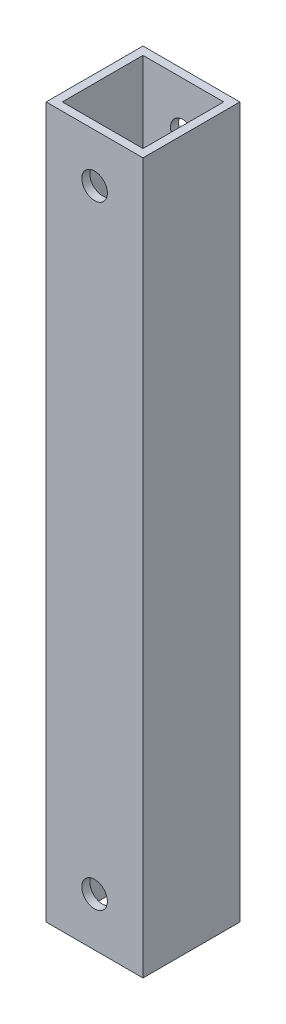
ISO-10303-21;
HEADER;
FILE_DESCRIPTION(('STEP AP214'),'2;1');
FILE_NAME('part.step','',(''),(''),'','','');
FILE_SCHEMA(('AUTOMOTIVE_DESIGN { 1 0 10303 214 1 1 1 1 }'));
ENDSEC;
DATA;
#1=APPLICATION_CONTEXT('core data for automotive mechanical design processes');
#2=APPLICATION_PROTOCOL_DEFINITION('international standard','automotive_design',2000,#1);
#3=PRODUCT_CONTEXT('',#1,'mechanical');
#4=PRODUCT('Part','Part','',(#3));
#5=PRODUCT_RELATED_PRODUCT_CATEGORY('part','',(#4));
#6=PRODUCT_DEFINITION_FORMATION('','',#4);
#7=PRODUCT_DEFINITION_CONTEXT('part definition',#1,'design');
#8=PRODUCT_DEFINITION('design','',#6,#7);
#9=PRODUCT_DEFINITION_SHAPE('','',#8);
#10=(LENGTH_UNIT() NAMED_UNIT(*) SI_UNIT(.MILLI.,.METRE.));
#11=(NAMED_UNIT(*) PLANE_ANGLE_UNIT() SI_UNIT($,.RADIAN.));
#12=(NAMED_UNIT(*) SI_UNIT($,.STERADIAN.) SOLID_ANGLE_UNIT());
#13=UNCERTAINTY_MEASURE_WITH_UNIT(LENGTH_MEASURE(1.E-05),#10,'distance_accuracy_value','');
#14=(GEOMETRIC_REPRESENTATION_CONTEXT(3) GLOBAL_UNCERTAINTY_ASSIGNED_CONTEXT((#13)) GLOBAL_UNIT_ASSIGNED_CONTEXT((#10,
#11,#12)) REPRESENTATION_CONTEXT('',''));
#15=CARTESIAN_POINT('',(0.,0.,0.));
#16=DIRECTION('',(0.,0.,1.));
#17=DIRECTION('',(1.,0.,0.));
#18=AXIS2_PLACEMENT_3D('',#15,#16,#17);
#19=CARTESIAN_POINT('',(0.,279.4,0.));
#20=DIRECTION('',(0.,-1.,0.));
#21=DIRECTION('',(0.,0.,-1.));
#22=AXIS2_PLACEMENT_3D('',#19,#20,#21);
#23=PLANE('',#22);
#24=DIRECTION('',(0.,0.,1.));
#25=VECTOR('',#24,1.);
#26=CARTESIAN_POINT('',(0.,279.4,0.));
#27=LINE('',#26,#25);
#28=CARTESIAN_POINT('',(0.,279.4,-38.1));
#29=VERTEX_POINT('',#28);
#30=CARTESIAN_POINT('',(0.,279.4,0.));
#31=VERTEX_POINT('',#30);
#32=EDGE_CURVE('E137',#29,#31,#27,.T.);
#33=ORIENTED_EDGE('',*,*,#32,.T.);
#34=DIRECTION('',(1.,0.,0.));
#35=VECTOR('',#34,1.);
#36=CARTESIAN_POINT('',(0.,279.4,0.));
#37=LINE('',#36,#35);
#38=CARTESIAN_POINT('',(38.1,279.4,0.));
#39=VERTEX_POINT('',#38);
#40=EDGE_CURVE('E140',#31,#39,#37,.T.);
#41=ORIENTED_EDGE('',*,*,#40,.T.);
#42=DIRECTION('',(0.,0.,-1.));
#43=VECTOR('',#42,1.);
#44=CARTESIAN_POINT('',(38.1,279.4,0.));
#45=LINE('',#44,#43);
#46=CARTESIAN_POINT('',(38.1,279.4,-38.1));
#47=VERTEX_POINT('',#46);
#48=EDGE_CURVE('E143',#39,#47,#45,.T.);
#49=ORIENTED_EDGE('',*,*,#48,.T.);
#50=DIRECTION('',(-1.,0.,0.));
#51=VECTOR('',#50,1.);
#52=CARTESIAN_POINT('',(0.,279.4,-38.1));
#53=LINE('',#52,#51);
#54=EDGE_CURVE('E145',#47,#29,#53,.T.);
#55=ORIENTED_EDGE('',*,*,#54,.T.);
#56=EDGE_LOOP('',(#33,#41,#49,#55));
#57=FACE_BOUND('',#56,.T.);
#58=DIRECTION('',(0.,0.,1.));
#59=VECTOR('',#58,1.);
#60=CARTESIAN_POINT('',(3.175,279.4,-3.175));
#61=LINE('',#60,#59);
#62=CARTESIAN_POINT('',(3.175,279.4,-34.925));
#63=VERTEX_POINT('',#62);
#64=CARTESIAN_POINT('',(3.175,279.4,-3.175));
#65=VERTEX_POINT('',#64);
#66=EDGE_CURVE('E99',#63,#65,#61,.T.);
#67=ORIENTED_EDGE('',*,*,#66,.F.);
#68=DIRECTION('',(-1.,0.,0.));
#69=VECTOR('',#68,1.);
#70=CARTESIAN_POINT('',(3.175,279.4,-34.925));
#71=LINE('',#70,#69);
#72=CARTESIAN_POINT('',(34.925,279.4,-34.925));
#73=VERTEX_POINT('',#72);
#74=EDGE_CURVE('E121',#73,#63,#71,.T.);
#75=ORIENTED_EDGE('',*,*,#74,.F.);
#76=DIRECTION('',(0.,0.,-1.));
#77=VECTOR('',#76,1.);
#78=CARTESIAN_POINT('',(34.925,279.4,-3.175));
#79=LINE('',#78,#77);
#80=CARTESIAN_POINT('',(34.925,279.4,-3.175));
#81=VERTEX_POINT('',#80);
#82=EDGE_CURVE('E119',#81,#73,#79,.T.);
#83=ORIENTED_EDGE('',*,*,#82,.F.);
#84=DIRECTION('',(1.,0.,0.));
#85=VECTOR('',#84,1.);
#86=CARTESIAN_POINT('',(3.175,279.4,-3.175));
#87=LINE('',#86,#85);
#88=EDGE_CURVE('E107',#65,#81,#87,.T.);
#89=ORIENTED_EDGE('',*,*,#88,.F.);
#90=EDGE_LOOP('',(#67,#75,#83,#89));
#91=FACE_BOUND('',#90,.T.);
#92=ADVANCED_FACE('F33',(#57,#91),#23,.F.);
#93=CARTESIAN_POINT('',(0.,0.,0.));
#94=DIRECTION('',(0.,-1.,0.));
#95=DIRECTION('',(0.,0.,-1.));
#96=AXIS2_PLACEMENT_3D('',#93,#94,#95);
#97=PLANE('',#96);
#98=DIRECTION('',(0.,0.,1.));
#99=VECTOR('',#98,1.);
#100=CARTESIAN_POINT('',(0.,0.,0.));
#101=LINE('',#100,#99);
#102=CARTESIAN_POINT('',(0.,0.,-38.1));
#103=VERTEX_POINT('',#102);
#104=CARTESIAN_POINT('',(0.,0.,0.));
#105=VERTEX_POINT('',#104);
#106=EDGE_CURVE('E115',#103,#105,#101,.T.);
#107=ORIENTED_EDGE('',*,*,#106,.F.);
#108=DIRECTION('',(-1.,0.,0.));
#109=VECTOR('',#108,1.);
#110=CARTESIAN_POINT('',(0.,0.,-38.1));
#111=LINE('',#110,#109);
#112=CARTESIAN_POINT('',(38.1,0.,-38.1));
#113=VERTEX_POINT('',#112);
#114=EDGE_CURVE('E141',#113,#103,#111,.T.);
#115=ORIENTED_EDGE('',*,*,#114,.F.);
#116=DIRECTION('',(0.,0.,-1.));
#117=VECTOR('',#116,1.);
#118=CARTESIAN_POINT('',(38.1,0.,0.));
#119=LINE('',#118,#117);
#120=CARTESIAN_POINT('',(38.1,0.,0.));
#121=VERTEX_POINT('',#120);
#122=EDGE_CURVE('E152',#121,#113,#119,.T.);
#123=ORIENTED_EDGE('',*,*,#122,.F.);
#124=DIRECTION('',(1.,0.,0.));
#125=VECTOR('',#124,1.);
#126=CARTESIAN_POINT('',(0.,0.,0.));
#127=LINE('',#126,#125);
#128=EDGE_CURVE('E150',#105,#121,#127,.T.);
#129=ORIENTED_EDGE('',*,*,#128,.F.);
#130=EDGE_LOOP('',(#107,#115,#123,#129));
#131=FACE_BOUND('',#130,.T.);
#132=DIRECTION('',(-1.,0.,0.));
#133=VECTOR('',#132,1.);
#134=CARTESIAN_POINT('',(3.175,0.,-34.925));
#135=LINE('',#134,#133);
#136=CARTESIAN_POINT('',(34.925,0.,-34.925));
#137=VERTEX_POINT('',#136);
#138=CARTESIAN_POINT('',(3.175,0.,-34.925));
#139=VERTEX_POINT('',#138);
#140=EDGE_CURVE('E108',#137,#139,#135,.T.);
#141=ORIENTED_EDGE('',*,*,#140,.T.);
#142=DIRECTION('',(0.,0.,1.));
#143=VECTOR('',#142,1.);
#144=CARTESIAN_POINT('',(3.175,0.,-3.175));
#145=LINE('',#144,#143);
#146=CARTESIAN_POINT('',(3.175,0.,-3.175));
#147=VERTEX_POINT('',#146);
#148=EDGE_CURVE('E57',#139,#147,#145,.T.);
#149=ORIENTED_EDGE('',*,*,#148,.T.);
#150=DIRECTION('',(1.,0.,0.));
#151=VECTOR('',#150,1.);
#152=CARTESIAN_POINT('',(3.175,0.,-3.175));
#153=LINE('',#152,#151);
#154=CARTESIAN_POINT('',(34.925,0.,-3.175));
#155=VERTEX_POINT('',#154);
#156=EDGE_CURVE('E114',#147,#155,#153,.T.);
#157=ORIENTED_EDGE('',*,*,#156,.T.);
#158=DIRECTION('',(0.,0.,-1.));
#159=VECTOR('',#158,1.);
#160=CARTESIAN_POINT('',(34.925,0.,-3.175));
#161=LINE('',#160,#159);
#162=EDGE_CURVE('E129',#155,#137,#161,.T.);
#163=ORIENTED_EDGE('',*,*,#162,.T.);
#164=EDGE_LOOP('',(#141,#149,#157,#163));
#165=FACE_BOUND('',#164,.T.);
#166=ADVANCED_FACE('F171',(#131,#165),#97,.T.);
#167=CARTESIAN_POINT('',(0.,279.4,0.));
#168=DIRECTION('',(1.,0.,0.));
#169=DIRECTION('',(0.,0.,-1.));
#170=AXIS2_PLACEMENT_3D('',#167,#168,#169);
#171=PLANE('',#170);
#172=ORIENTED_EDGE('',*,*,#106,.T.);
#173=DIRECTION('',(0.,-1.,0.));
#174=VECTOR('',#173,1.);
#175=CARTESIAN_POINT('',(0.,279.4,0.));
#176=LINE('',#175,#174);
#177=EDGE_CURVE('E11',#31,#105,#176,.T.);
#178=ORIENTED_EDGE('',*,*,#177,.F.);
#179=ORIENTED_EDGE('',*,*,#32,.F.);
#180=DIRECTION('',(0.,-1.,0.));
#181=VECTOR('',#180,1.);
#182=CARTESIAN_POINT('',(0.,279.4,-38.1));
#183=LINE('',#182,#181);
#184=EDGE_CURVE('E147',#29,#103,#183,.T.);
#185=ORIENTED_EDGE('',*,*,#184,.T.);
#186=EDGE_LOOP('',(#172,#178,#179,#185));
#187=FACE_BOUND('',#186,.T.);
#188=ADVANCED_FACE('F35',(#187),#171,.F.);
#189=CARTESIAN_POINT('',(0.,279.4,0.));
#190=DIRECTION('',(0.,0.,-1.));
#191=DIRECTION('',(-1.,0.,0.));
#192=AXIS2_PLACEMENT_3D('',#189,#190,#191);
#193=PLANE('',#192);
#194=CARTESIAN_POINT('',(19.05,260.35,0.));
#195=DIRECTION('',(0.,0.,1.));
#196=DIRECTION('',(1.,0.,0.));
#197=AXIS2_PLACEMENT_3D('',#194,#195,#196);
#198=CIRCLE('',#197,5.0419);
#199=CARTESIAN_POINT('',(24.0919,260.35,0.));
#200=VERTEX_POINT('',#199);
#201=EDGE_CURVE('E258',#200,#200,#198,.T.);
#202=ORIENTED_EDGE('',*,*,#201,.F.);
#203=EDGE_LOOP('',(#202));
#204=FACE_BOUND('',#203,.T.);
#205=CARTESIAN_POINT('',(19.05,19.05,0.));
#206=DIRECTION('',(0.,0.,1.));
#207=DIRECTION('',(1.,0.,0.));
#208=AXIS2_PLACEMENT_3D('',#205,#206,#207);
#209=CIRCLE('',#208,5.0419);
#210=CARTESIAN_POINT('',(24.0919,19.05,0.));
#211=VERTEX_POINT('',#210);
#212=EDGE_CURVE('E216',#211,#211,#209,.T.);
#213=ORIENTED_EDGE('',*,*,#212,.F.);
#214=EDGE_LOOP('',(#213));
#215=FACE_BOUND('',#214,.T.);
#216=ORIENTED_EDGE('',*,*,#128,.T.);
#217=DIRECTION('',(0.,-1.,0.));
#218=VECTOR('',#217,1.);
#219=CARTESIAN_POINT('',(38.1,279.4,0.));
#220=LINE('',#219,#218);
#221=EDGE_CURVE('E42',#39,#121,#220,.T.);
#222=ORIENTED_EDGE('',*,*,#221,.F.);
#223=ORIENTED_EDGE('',*,*,#40,.F.);
#224=ORIENTED_EDGE('',*,*,#177,.T.);
#225=EDGE_LOOP('',(#216,#222,#223,#224));
#226=FACE_BOUND('',#225,.T.);
#227=ADVANCED_FACE('F181',(#204,#215,#226),#193,.F.);
#228=CARTESIAN_POINT('',(38.1,279.4,0.));
#229=DIRECTION('',(-1.,0.,0.));
#230=DIRECTION('',(0.,0.,1.));
#231=AXIS2_PLACEMENT_3D('',#228,#229,#230);
#232=PLANE('',#231);
#233=ORIENTED_EDGE('',*,*,#122,.T.);
#234=DIRECTION('',(0.,-1.,0.));
#235=VECTOR('',#234,1.);
#236=CARTESIAN_POINT('',(38.1,279.4,-38.1));
#237=LINE('',#236,#235);
#238=EDGE_CURVE('E157',#47,#113,#237,.T.);
#239=ORIENTED_EDGE('',*,*,#238,.F.);
#240=ORIENTED_EDGE('',*,*,#48,.F.);
#241=ORIENTED_EDGE('',*,*,#221,.T.);
#242=EDGE_LOOP('',(#233,#239,#240,#241));
#243=FACE_BOUND('',#242,.T.);
#244=ADVANCED_FACE('F165',(#243),#232,.F.);
#245=CARTESIAN_POINT('',(0.,279.4,-38.1));
#246=DIRECTION('',(0.,0.,1.));
#247=DIRECTION('',(1.,0.,0.));
#248=AXIS2_PLACEMENT_3D('',#245,#246,#247);
#249=PLANE('',#248);
#250=CARTESIAN_POINT('',(19.05,260.35,-38.1));
#251=DIRECTION('',(0.,0.,1.));
#252=DIRECTION('',(1.,0.,0.));
#253=AXIS2_PLACEMENT_3D('',#250,#251,#252);
#254=CIRCLE('',#253,5.04189999999999);
#255=CARTESIAN_POINT('',(24.0919,260.35,-38.1));
#256=VERTEX_POINT('',#255);
#257=EDGE_CURVE('E210',#256,#256,#254,.T.);
#258=ORIENTED_EDGE('',*,*,#257,.T.);
#259=EDGE_LOOP('',(#258));
#260=FACE_BOUND('',#259,.T.);
#261=CARTESIAN_POINT('',(19.05,19.05,-38.1));
#262=DIRECTION('',(0.,0.,1.));
#263=DIRECTION('',(1.,0.,0.));
#264=AXIS2_PLACEMENT_3D('',#261,#262,#263);
#265=CIRCLE('',#264,5.04189999999999);
#266=CARTESIAN_POINT('',(24.0919,19.05,-38.1));
#267=VERTEX_POINT('',#266);
#268=EDGE_CURVE('E213',#267,#267,#265,.T.);
#269=ORIENTED_EDGE('',*,*,#268,.T.);
#270=EDGE_LOOP('',(#269));
#271=FACE_BOUND('',#270,.T.);
#272=ORIENTED_EDGE('',*,*,#114,.T.);
#273=ORIENTED_EDGE('',*,*,#184,.F.);
#274=ORIENTED_EDGE('',*,*,#54,.F.);
#275=ORIENTED_EDGE('',*,*,#238,.T.);
#276=EDGE_LOOP('',(#272,#273,#274,#275));
#277=FACE_BOUND('',#276,.T.);
#278=ADVANCED_FACE('F175',(#260,#271,#277),#249,.F.);
#279=CARTESIAN_POINT('',(3.175,279.4,-3.175));
#280=DIRECTION('',(1.,0.,0.));
#281=DIRECTION('',(0.,0.,-1.));
#282=AXIS2_PLACEMENT_3D('',#279,#280,#281);
#283=PLANE('',#282);
#284=ORIENTED_EDGE('',*,*,#148,.F.);
#285=DIRECTION('',(0.,-1.,0.));
#286=VECTOR('',#285,1.);
#287=CARTESIAN_POINT('',(3.175,279.4,-34.925));
#288=LINE('',#287,#286);
#289=EDGE_CURVE('E103',#63,#139,#288,.T.);
#290=ORIENTED_EDGE('',*,*,#289,.F.);
#291=ORIENTED_EDGE('',*,*,#66,.T.);
#292=DIRECTION('',(0.,-1.,0.));
#293=VECTOR('',#292,1.);
#294=CARTESIAN_POINT('',(3.175,279.4,-3.175));
#295=LINE('',#294,#293);
#296=EDGE_CURVE('E102',#65,#147,#295,.T.);
#297=ORIENTED_EDGE('',*,*,#296,.T.);
#298=EDGE_LOOP('',(#284,#290,#291,#297));
#299=FACE_BOUND('',#298,.T.);
#300=ADVANCED_FACE('F101',(#299),#283,.T.);
#301=CARTESIAN_POINT('',(3.175,279.4,-3.175));
#302=DIRECTION('',(0.,0.,-1.));
#303=DIRECTION('',(-1.,0.,0.));
#304=AXIS2_PLACEMENT_3D('',#301,#302,#303);
#305=PLANE('',#304);
#306=CARTESIAN_POINT('',(19.05,260.35,-3.175));
#307=DIRECTION('',(0.,0.,-1.));
#308=DIRECTION('',(-1.,0.,0.));
#309=AXIS2_PLACEMENT_3D('',#306,#307,#308);
#310=CIRCLE('',#309,5.0419);
#311=CARTESIAN_POINT('',(14.0081,260.35,-3.175));
#312=VERTEX_POINT('',#311);
#313=EDGE_CURVE('E221',#312,#312,#310,.T.);
#314=ORIENTED_EDGE('',*,*,#313,.F.);
#315=EDGE_LOOP('',(#314));
#316=FACE_BOUND('',#315,.T.);
#317=CARTESIAN_POINT('',(19.05,19.05,-3.175));
#318=DIRECTION('',(0.,0.,-1.));
#319=DIRECTION('',(-1.,0.,0.));
#320=AXIS2_PLACEMENT_3D('',#317,#318,#319);
#321=CIRCLE('',#320,5.0419);
#322=CARTESIAN_POINT('',(14.0081,19.05,-3.175));
#323=VERTEX_POINT('',#322);
#324=EDGE_CURVE('E215',#323,#323,#321,.T.);
#325=ORIENTED_EDGE('',*,*,#324,.F.);
#326=EDGE_LOOP('',(#325));
#327=FACE_BOUND('',#326,.T.);
#328=ORIENTED_EDGE('',*,*,#156,.F.);
#329=ORIENTED_EDGE('',*,*,#296,.F.);
#330=ORIENTED_EDGE('',*,*,#88,.T.);
#331=DIRECTION('',(0.,-1.,0.));
#332=VECTOR('',#331,1.);
#333=CARTESIAN_POINT('',(34.925,279.4,-3.175));
#334=LINE('',#333,#332);
#335=EDGE_CURVE('E116',#81,#155,#334,.T.);
#336=ORIENTED_EDGE('',*,*,#335,.T.);
#337=EDGE_LOOP('',(#328,#329,#330,#336));
#338=FACE_BOUND('',#337,.T.);
#339=ADVANCED_FACE('F111',(#316,#327,#338),#305,.T.);
#340=CARTESIAN_POINT('',(34.925,279.4,-3.175));
#341=DIRECTION('',(-1.,0.,0.));
#342=DIRECTION('',(0.,0.,1.));
#343=AXIS2_PLACEMENT_3D('',#340,#341,#342);
#344=PLANE('',#343);
#345=ORIENTED_EDGE('',*,*,#162,.F.);
#346=ORIENTED_EDGE('',*,*,#335,.F.);
#347=ORIENTED_EDGE('',*,*,#82,.T.);
#348=DIRECTION('',(0.,-1.,0.));
#349=VECTOR('',#348,1.);
#350=CARTESIAN_POINT('',(34.925,279.4,-34.925));
#351=LINE('',#350,#349);
#352=EDGE_CURVE('E49',#73,#137,#351,.T.);
#353=ORIENTED_EDGE('',*,*,#352,.T.);
#354=EDGE_LOOP('',(#345,#346,#347,#353));
#355=FACE_BOUND('',#354,.T.);
#356=ADVANCED_FACE('F231',(#355),#344,.T.);
#357=CARTESIAN_POINT('',(3.175,279.4,-34.925));
#358=DIRECTION('',(0.,0.,1.));
#359=DIRECTION('',(1.,0.,0.));
#360=AXIS2_PLACEMENT_3D('',#357,#358,#359);
#361=PLANE('',#360);
#362=CARTESIAN_POINT('',(19.05,260.35,-34.925));
#363=DIRECTION('',(0.,0.,1.));
#364=DIRECTION('',(1.,0.,0.));
#365=AXIS2_PLACEMENT_3D('',#362,#363,#364);
#366=CIRCLE('',#365,5.0419);
#367=CARTESIAN_POINT('',(24.0919,260.35,-34.925));
#368=VERTEX_POINT('',#367);
#369=EDGE_CURVE('E37',#368,#368,#366,.T.);
#370=ORIENTED_EDGE('',*,*,#369,.F.);
#371=EDGE_LOOP('',(#370));
#372=FACE_BOUND('',#371,.T.);
#373=CARTESIAN_POINT('',(19.05,19.05,-34.925));
#374=DIRECTION('',(0.,0.,1.));
#375=DIRECTION('',(1.,0.,0.));
#376=AXIS2_PLACEMENT_3D('',#373,#374,#375);
#377=CIRCLE('',#376,5.0419);
#378=CARTESIAN_POINT('',(24.0919,19.05,-34.925));
#379=VERTEX_POINT('',#378);
#380=EDGE_CURVE('E127',#379,#379,#377,.T.);
#381=ORIENTED_EDGE('',*,*,#380,.F.);
#382=EDGE_LOOP('',(#381));
#383=FACE_BOUND('',#382,.T.);
#384=ORIENTED_EDGE('',*,*,#140,.F.);
#385=ORIENTED_EDGE('',*,*,#352,.F.);
#386=ORIENTED_EDGE('',*,*,#74,.T.);
#387=ORIENTED_EDGE('',*,*,#289,.T.);
#388=EDGE_LOOP('',(#384,#385,#386,#387));
#389=FACE_BOUND('',#388,.T.);
#390=ADVANCED_FACE('F229',(#372,#383,#389),#361,.T.);
#391=CARTESIAN_POINT('',(19.05,19.05,0.));
#392=DIRECTION('',(0.,0.,1.));
#393=DIRECTION('',(1.,0.,0.));
#394=AXIS2_PLACEMENT_3D('',#391,#392,#393);
#395=CYLINDRICAL_SURFACE('',#394,5.0419);
#396=ORIENTED_EDGE('',*,*,#380,.T.);
#397=EDGE_LOOP('',(#396));
#398=FACE_BOUND('',#397,.T.);
#399=ORIENTED_EDGE('',*,*,#268,.F.);
#400=EDGE_LOOP('',(#399));
#401=FACE_BOUND('',#400,.T.);
#402=ADVANCED_FACE('F227',(#398,#401),#395,.F.);
#403=ORIENTED_EDGE('',*,*,#324,.T.);
#404=EDGE_LOOP('',(#403));
#405=FACE_BOUND('',#404,.T.);
#406=ORIENTED_EDGE('',*,*,#212,.T.);
#407=EDGE_LOOP('',(#406));
#408=FACE_BOUND('',#407,.T.);
#409=ADVANCED_FACE('F243',(#405,#408),#395,.F.);
#410=CARTESIAN_POINT('',(19.05,260.35,0.));
#411=DIRECTION('',(0.,0.,1.));
#412=DIRECTION('',(1.,0.,0.));
#413=AXIS2_PLACEMENT_3D('',#410,#411,#412);
#414=CYLINDRICAL_SURFACE('',#413,5.0419);
#415=ORIENTED_EDGE('',*,*,#369,.T.);
#416=EDGE_LOOP('',(#415));
#417=FACE_BOUND('',#416,.T.);
#418=ORIENTED_EDGE('',*,*,#257,.F.);
#419=EDGE_LOOP('',(#418));
#420=FACE_BOUND('',#419,.T.);
#421=ADVANCED_FACE('F246',(#417,#420),#414,.F.);
#422=ORIENTED_EDGE('',*,*,#313,.T.);
#423=EDGE_LOOP('',(#422));
#424=FACE_BOUND('',#423,.T.);
#425=ORIENTED_EDGE('',*,*,#201,.T.);
#426=EDGE_LOOP('',(#425));
#427=FACE_BOUND('',#426,.T.);
#428=ADVANCED_FACE('F249',(#424,#427),#414,.F.);
#429=CLOSED_SHELL('',(#92,#166,#188,#227,#244,#278,#300,#339,#356,#390,#402,#409,#421,#428));
#430=MANIFOLD_SOLID_BREP('B2',#429);
#431=ADVANCED_BREP_SHAPE_REPRESENTATION('',(#18,#430),#14);
#432=SHAPE_DEFINITION_REPRESENTATION(#9,#431);
ENDSEC;
END-ISO-10303-21;
